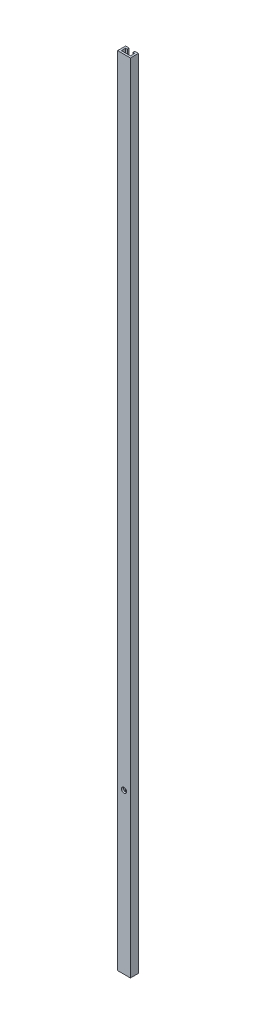
ISO-10303-21;
HEADER;
FILE_DESCRIPTION(('STEP AP214'),'2;1');
FILE_NAME('part.step','',(''),(''),'','','');
FILE_SCHEMA(('AUTOMOTIVE_DESIGN { 1 0 10303 214 1 1 1 1 }'));
ENDSEC;
DATA;
#1=APPLICATION_CONTEXT('core data for automotive mechanical design processes');
#2=APPLICATION_PROTOCOL_DEFINITION('international standard','automotive_design',2000,#1);
#3=PRODUCT_CONTEXT('',#1,'mechanical');
#4=PRODUCT('Part','Part','',(#3));
#5=PRODUCT_RELATED_PRODUCT_CATEGORY('part','',(#4));
#6=PRODUCT_DEFINITION_FORMATION('','',#4);
#7=PRODUCT_DEFINITION_CONTEXT('part definition',#1,'design');
#8=PRODUCT_DEFINITION('design','',#6,#7);
#9=PRODUCT_DEFINITION_SHAPE('','',#8);
#10=(LENGTH_UNIT() NAMED_UNIT(*) SI_UNIT(.MILLI.,.METRE.));
#11=(NAMED_UNIT(*) PLANE_ANGLE_UNIT() SI_UNIT($,.RADIAN.));
#12=(NAMED_UNIT(*) SI_UNIT($,.STERADIAN.) SOLID_ANGLE_UNIT());
#13=UNCERTAINTY_MEASURE_WITH_UNIT(LENGTH_MEASURE(1.E-05),#10,'distance_accuracy_value','');
#14=(GEOMETRIC_REPRESENTATION_CONTEXT(3) GLOBAL_UNCERTAINTY_ASSIGNED_CONTEXT((#13)) GLOBAL_UNIT_ASSIGNED_CONTEXT((#10,
#11,#12)) REPRESENTATION_CONTEXT('',''));
#15=CARTESIAN_POINT('',(0.,0.,0.));
#16=DIRECTION('',(0.,0.,1.));
#17=DIRECTION('',(1.,0.,0.));
#18=AXIS2_PLACEMENT_3D('',#15,#16,#17);
#19=CARTESIAN_POINT('',(0.,500.,0.));
#20=DIRECTION('',(1.,0.,0.));
#21=DIRECTION('',(0.,0.,-1.));
#22=AXIS2_PLACEMENT_3D('',#19,#20,#21);
#23=PLANE('',#22);
#24=DIRECTION('',(0.,0.,1.));
#25=VECTOR('',#24,1.);
#26=CARTESIAN_POINT('',(0.,0.,0.));
#27=LINE('',#26,#25);
#28=CARTESIAN_POINT('',(0.,0.,0.));
#29=VERTEX_POINT('',#28);
#30=CARTESIAN_POINT('',(0.,0.,5.));
#31=VERTEX_POINT('',#30);
#32=EDGE_CURVE('E163',#29,#31,#27,.T.);
#33=ORIENTED_EDGE('',*,*,#32,.T.);
#34=DIRECTION('',(0.,-1.,0.));
#35=VECTOR('',#34,1.);
#36=CARTESIAN_POINT('',(0.,500.,5.));
#37=LINE('',#36,#35);
#38=CARTESIAN_POINT('',(0.,500.,5.));
#39=VERTEX_POINT('',#38);
#40=EDGE_CURVE('E11',#39,#31,#37,.T.);
#41=ORIENTED_EDGE('',*,*,#40,.F.);
#42=DIRECTION('',(0.,0.,1.));
#43=VECTOR('',#42,1.);
#44=CARTESIAN_POINT('',(0.,500.,0.));
#45=LINE('',#44,#43);
#46=CARTESIAN_POINT('',(0.,500.,0.));
#47=VERTEX_POINT('',#46);
#48=EDGE_CURVE('E198',#47,#39,#45,.T.);
#49=ORIENTED_EDGE('',*,*,#48,.F.);
#50=DIRECTION('',(0.,-1.,0.));
#51=VECTOR('',#50,1.);
#52=CARTESIAN_POINT('',(0.,500.,0.));
#53=LINE('',#52,#51);
#54=EDGE_CURVE('E159',#47,#29,#53,.T.);
#55=ORIENTED_EDGE('',*,*,#54,.T.);
#56=EDGE_LOOP('',(#33,#41,#49,#55));
#57=FACE_BOUND('',#56,.T.);
#58=ADVANCED_FACE('F38',(#57),#23,.F.);
#59=CARTESIAN_POINT('',(0.,500.,5.));
#60=DIRECTION('',(0.,0.,-1.));
#61=DIRECTION('',(-1.,0.,0.));
#62=AXIS2_PLACEMENT_3D('',#59,#60,#61);
#63=PLANE('',#62);
#64=CARTESIAN_POINT('',(3.99999999999999,100.,5.));
#65=DIRECTION('',(0.,0.,1.));
#66=DIRECTION('',(1.,0.,0.));
#67=AXIS2_PLACEMENT_3D('',#64,#65,#66);
#68=CIRCLE('',#67,1.6);
#69=CARTESIAN_POINT('',(5.59999999999999,100.,5.));
#70=VERTEX_POINT('',#69);
#71=EDGE_CURVE('E378',#70,#70,#68,.T.);
#72=ORIENTED_EDGE('',*,*,#71,.F.);
#73=EDGE_LOOP('',(#72));
#74=FACE_BOUND('',#73,.T.);
#75=DIRECTION('',(1.,0.,0.));
#76=VECTOR('',#75,1.);
#77=CARTESIAN_POINT('',(0.,0.,5.));
#78=LINE('',#77,#76);
#79=CARTESIAN_POINT('',(8.,0.,5.));
#80=VERTEX_POINT('',#79);
#81=EDGE_CURVE('E167',#31,#80,#78,.T.);
#82=ORIENTED_EDGE('',*,*,#81,.T.);
#83=DIRECTION('',(0.,-1.,0.));
#84=VECTOR('',#83,1.);
#85=CARTESIAN_POINT('',(8.,500.,5.));
#86=LINE('',#85,#84);
#87=CARTESIAN_POINT('',(8.,500.,5.));
#88=VERTEX_POINT('',#87);
#89=EDGE_CURVE('E47',#88,#80,#86,.T.);
#90=ORIENTED_EDGE('',*,*,#89,.F.);
#91=DIRECTION('',(1.,0.,0.));
#92=VECTOR('',#91,1.);
#93=CARTESIAN_POINT('',(0.,500.,5.));
#94=LINE('',#93,#92);
#95=EDGE_CURVE('E110',#39,#88,#94,.T.);
#96=ORIENTED_EDGE('',*,*,#95,.F.);
#97=ORIENTED_EDGE('',*,*,#40,.T.);
#98=EDGE_LOOP('',(#82,#90,#96,#97));
#99=FACE_BOUND('',#98,.T.);
#100=ADVANCED_FACE('F292',(#74,#99),#63,.F.);
#101=CARTESIAN_POINT('',(8.,500.,5.));
#102=DIRECTION('',(-1.,0.,0.));
#103=DIRECTION('',(0.,0.,1.));
#104=AXIS2_PLACEMENT_3D('',#101,#102,#103);
#105=PLANE('',#104);
#106=DIRECTION('',(0.,0.,-1.));
#107=VECTOR('',#106,1.);
#108=CARTESIAN_POINT('',(8.,0.,5.));
#109=LINE('',#108,#107);
#110=CARTESIAN_POINT('',(8.,0.,0.));
#111=VERTEX_POINT('',#110);
#112=EDGE_CURVE('E171',#80,#111,#109,.T.);
#113=ORIENTED_EDGE('',*,*,#112,.T.);
#114=DIRECTION('',(0.,-1.,0.));
#115=VECTOR('',#114,1.);
#116=CARTESIAN_POINT('',(8.,500.,0.));
#117=LINE('',#116,#115);
#118=CARTESIAN_POINT('',(8.,500.,0.));
#119=VERTEX_POINT('',#118);
#120=EDGE_CURVE('E225',#119,#111,#117,.T.);
#121=ORIENTED_EDGE('',*,*,#120,.F.);
#122=DIRECTION('',(0.,0.,-1.));
#123=VECTOR('',#122,1.);
#124=CARTESIAN_POINT('',(8.,500.,5.));
#125=LINE('',#124,#123);
#126=EDGE_CURVE('E235',#88,#119,#125,.T.);
#127=ORIENTED_EDGE('',*,*,#126,.F.);
#128=ORIENTED_EDGE('',*,*,#89,.T.);
#129=EDGE_LOOP('',(#113,#121,#127,#128));
#130=FACE_BOUND('',#129,.T.);
#131=ADVANCED_FACE('F233',(#130),#105,.F.);
#132=CARTESIAN_POINT('',(8.,500.,0.));
#133=DIRECTION('',(0.,0.,1.));
#134=DIRECTION('',(1.,0.,0.));
#135=AXIS2_PLACEMENT_3D('',#132,#133,#134);
#136=PLANE('',#135);
#137=DIRECTION('',(-1.,0.,0.));
#138=VECTOR('',#137,1.);
#139=CARTESIAN_POINT('',(8.,0.,0.));
#140=LINE('',#139,#138);
#141=CARTESIAN_POINT('',(5.75,0.,0.));
#142=VERTEX_POINT('',#141);
#143=EDGE_CURVE('E174',#111,#142,#140,.T.);
#144=ORIENTED_EDGE('',*,*,#143,.T.);
#145=DIRECTION('',(0.,-1.,0.));
#146=VECTOR('',#145,1.);
#147=CARTESIAN_POINT('',(5.75,500.,0.));
#148=LINE('',#147,#146);
#149=CARTESIAN_POINT('',(5.75,500.,0.));
#150=VERTEX_POINT('',#149);
#151=EDGE_CURVE('E221',#150,#142,#148,.T.);
#152=ORIENTED_EDGE('',*,*,#151,.F.);
#153=DIRECTION('',(-1.,0.,0.));
#154=VECTOR('',#153,1.);
#155=CARTESIAN_POINT('',(8.,500.,0.));
#156=LINE('',#155,#154);
#157=EDGE_CURVE('E254',#119,#150,#156,.T.);
#158=ORIENTED_EDGE('',*,*,#157,.F.);
#159=ORIENTED_EDGE('',*,*,#120,.T.);
#160=EDGE_LOOP('',(#144,#152,#158,#159));
#161=FACE_BOUND('',#160,.T.);
#162=ADVANCED_FACE('F244',(#161),#136,.F.);
#163=CARTESIAN_POINT('',(5.75,500.,0.));
#164=DIRECTION('',(1.,0.,0.));
#165=DIRECTION('',(0.,0.,-1.));
#166=AXIS2_PLACEMENT_3D('',#163,#164,#165);
#167=PLANE('',#166);
#168=DIRECTION('',(0.,0.,1.));
#169=VECTOR('',#168,1.);
#170=CARTESIAN_POINT('',(5.75,0.,0.));
#171=LINE('',#170,#169);
#172=CARTESIAN_POINT('',(5.75,0.,1.15));
#173=VERTEX_POINT('',#172);
#174=EDGE_CURVE('E177',#142,#173,#171,.T.);
#175=ORIENTED_EDGE('',*,*,#174,.T.);
#176=DIRECTION('',(0.,-1.,0.));
#177=VECTOR('',#176,1.);
#178=CARTESIAN_POINT('',(5.75,500.,1.15));
#179=LINE('',#178,#177);
#180=CARTESIAN_POINT('',(5.75,500.,1.15));
#181=VERTEX_POINT('',#180);
#182=EDGE_CURVE('E217',#181,#173,#179,.T.);
#183=ORIENTED_EDGE('',*,*,#182,.F.);
#184=DIRECTION('',(0.,0.,1.));
#185=VECTOR('',#184,1.);
#186=CARTESIAN_POINT('',(5.75,500.,0.));
#187=LINE('',#186,#185);
#188=EDGE_CURVE('E250',#150,#181,#187,.T.);
#189=ORIENTED_EDGE('',*,*,#188,.F.);
#190=ORIENTED_EDGE('',*,*,#151,.T.);
#191=EDGE_LOOP('',(#175,#183,#189,#190));
#192=FACE_BOUND('',#191,.T.);
#193=ADVANCED_FACE('F248',(#192),#167,.F.);
#194=CARTESIAN_POINT('',(5.75,500.,1.15));
#195=DIRECTION('',(0.,0.,-1.));
#196=DIRECTION('',(-1.,0.,0.));
#197=AXIS2_PLACEMENT_3D('',#194,#195,#196);
#198=PLANE('',#197);
#199=DIRECTION('',(1.,0.,0.));
#200=VECTOR('',#199,1.);
#201=CARTESIAN_POINT('',(5.75,0.,1.15));
#202=LINE('',#201,#200);
#203=CARTESIAN_POINT('',(6.85,0.,1.15));
#204=VERTEX_POINT('',#203);
#205=EDGE_CURVE('E180',#173,#204,#202,.T.);
#206=ORIENTED_EDGE('',*,*,#205,.T.);
#207=DIRECTION('',(0.,-1.,0.));
#208=VECTOR('',#207,1.);
#209=CARTESIAN_POINT('',(6.85,500.,1.15));
#210=LINE('',#209,#208);
#211=CARTESIAN_POINT('',(6.85,500.,1.15));
#212=VERTEX_POINT('',#211);
#213=EDGE_CURVE('E213',#212,#204,#210,.T.);
#214=ORIENTED_EDGE('',*,*,#213,.F.);
#215=DIRECTION('',(1.,0.,0.));
#216=VECTOR('',#215,1.);
#217=CARTESIAN_POINT('',(5.75,500.,1.15));
#218=LINE('',#217,#216);
#219=EDGE_CURVE('E253',#181,#212,#218,.T.);
#220=ORIENTED_EDGE('',*,*,#219,.F.);
#221=ORIENTED_EDGE('',*,*,#182,.T.);
#222=EDGE_LOOP('',(#206,#214,#220,#221));
#223=FACE_BOUND('',#222,.T.);
#224=ADVANCED_FACE('F307',(#223),#198,.F.);
#225=CARTESIAN_POINT('',(6.85,500.,1.15));
#226=DIRECTION('',(1.,0.,0.));
#227=DIRECTION('',(0.,0.,-1.));
#228=AXIS2_PLACEMENT_3D('',#225,#226,#227);
#229=PLANE('',#228);
#230=DIRECTION('',(0.,0.,1.));
#231=VECTOR('',#230,1.);
#232=CARTESIAN_POINT('',(6.85,0.,1.15));
#233=LINE('',#232,#231);
#234=CARTESIAN_POINT('',(6.85,0.,3.85));
#235=VERTEX_POINT('',#234);
#236=EDGE_CURVE('E183',#204,#235,#233,.T.);
#237=ORIENTED_EDGE('',*,*,#236,.T.);
#238=DIRECTION('',(0.,-1.,0.));
#239=VECTOR('',#238,1.);
#240=CARTESIAN_POINT('',(6.85,500.,3.85));
#241=LINE('',#240,#239);
#242=CARTESIAN_POINT('',(6.85,500.,3.85));
#243=VERTEX_POINT('',#242);
#244=EDGE_CURVE('E209',#243,#235,#241,.T.);
#245=ORIENTED_EDGE('',*,*,#244,.F.);
#246=DIRECTION('',(0.,0.,1.));
#247=VECTOR('',#246,1.);
#248=CARTESIAN_POINT('',(6.85,500.,1.15));
#249=LINE('',#248,#247);
#250=EDGE_CURVE('E258',#212,#243,#249,.T.);
#251=ORIENTED_EDGE('',*,*,#250,.F.);
#252=ORIENTED_EDGE('',*,*,#213,.T.);
#253=EDGE_LOOP('',(#237,#245,#251,#252));
#254=FACE_BOUND('',#253,.T.);
#255=ADVANCED_FACE('F310',(#254),#229,.F.);
#256=CARTESIAN_POINT('',(6.85,500.,3.85));
#257=DIRECTION('',(0.,0.,1.));
#258=DIRECTION('',(1.,0.,0.));
#259=AXIS2_PLACEMENT_3D('',#256,#257,#258);
#260=PLANE('',#259);
#261=CARTESIAN_POINT('',(3.99999999999999,100.,3.85));
#262=DIRECTION('',(0.,0.,1.));
#263=DIRECTION('',(1.,0.,0.));
#264=AXIS2_PLACEMENT_3D('',#261,#262,#263);
#265=CIRCLE('',#264,1.6);
#266=CARTESIAN_POINT('',(5.59999999999999,100.,3.85));
#267=VERTEX_POINT('',#266);
#268=EDGE_CURVE('E168',#267,#267,#265,.F.);
#269=ORIENTED_EDGE('',*,*,#268,.F.);
#270=EDGE_LOOP('',(#269));
#271=FACE_BOUND('',#270,.T.);
#272=DIRECTION('',(-1.,0.,0.));
#273=VECTOR('',#272,1.);
#274=CARTESIAN_POINT('',(6.85,0.,3.85));
#275=LINE('',#274,#273);
#276=CARTESIAN_POINT('',(1.15,0.,3.85));
#277=VERTEX_POINT('',#276);
#278=EDGE_CURVE('E186',#235,#277,#275,.T.);
#279=ORIENTED_EDGE('',*,*,#278,.T.);
#280=DIRECTION('',(0.,-1.,0.));
#281=VECTOR('',#280,1.);
#282=CARTESIAN_POINT('',(1.15,500.,3.85));
#283=LINE('',#282,#281);
#284=CARTESIAN_POINT('',(1.15,500.,3.85));
#285=VERTEX_POINT('',#284);
#286=EDGE_CURVE('E205',#285,#277,#283,.T.);
#287=ORIENTED_EDGE('',*,*,#286,.F.);
#288=DIRECTION('',(-1.,0.,0.));
#289=VECTOR('',#288,1.);
#290=CARTESIAN_POINT('',(6.85,500.,3.85));
#291=LINE('',#290,#289);
#292=EDGE_CURVE('E265',#243,#285,#291,.T.);
#293=ORIENTED_EDGE('',*,*,#292,.F.);
#294=ORIENTED_EDGE('',*,*,#244,.T.);
#295=EDGE_LOOP('',(#279,#287,#293,#294));
#296=FACE_BOUND('',#295,.T.);
#297=ADVANCED_FACE('F273',(#271,#296),#260,.F.);
#298=CARTESIAN_POINT('',(1.15,500.,3.85));
#299=DIRECTION('',(-1.,0.,0.));
#300=DIRECTION('',(0.,0.,1.));
#301=AXIS2_PLACEMENT_3D('',#298,#299,#300);
#302=PLANE('',#301);
#303=DIRECTION('',(0.,0.,-1.));
#304=VECTOR('',#303,1.);
#305=CARTESIAN_POINT('',(1.15,0.,3.85));
#306=LINE('',#305,#304);
#307=CARTESIAN_POINT('',(1.15,0.,1.15));
#308=VERTEX_POINT('',#307);
#309=EDGE_CURVE('E189',#277,#308,#306,.T.);
#310=ORIENTED_EDGE('',*,*,#309,.T.);
#311=DIRECTION('',(0.,-1.,0.));
#312=VECTOR('',#311,1.);
#313=CARTESIAN_POINT('',(1.15,500.,1.15));
#314=LINE('',#313,#312);
#315=CARTESIAN_POINT('',(1.15,500.,1.15));
#316=VERTEX_POINT('',#315);
#317=EDGE_CURVE('E152',#316,#308,#314,.T.);
#318=ORIENTED_EDGE('',*,*,#317,.F.);
#319=DIRECTION('',(0.,0.,-1.));
#320=VECTOR('',#319,1.);
#321=CARTESIAN_POINT('',(1.15,500.,3.85));
#322=LINE('',#321,#320);
#323=EDGE_CURVE('E141',#285,#316,#322,.T.);
#324=ORIENTED_EDGE('',*,*,#323,.F.);
#325=ORIENTED_EDGE('',*,*,#286,.T.);
#326=EDGE_LOOP('',(#310,#318,#324,#325));
#327=FACE_BOUND('',#326,.T.);
#328=ADVANCED_FACE('F277',(#327),#302,.F.);
#329=CARTESIAN_POINT('',(1.15,500.,1.15));
#330=DIRECTION('',(0.,0.,-1.));
#331=DIRECTION('',(-1.,0.,0.));
#332=AXIS2_PLACEMENT_3D('',#329,#330,#331);
#333=PLANE('',#332);
#334=DIRECTION('',(1.,0.,0.));
#335=VECTOR('',#334,1.);
#336=CARTESIAN_POINT('',(1.15,0.,1.15));
#337=LINE('',#336,#335);
#338=CARTESIAN_POINT('',(2.25,0.,1.15));
#339=VERTEX_POINT('',#338);
#340=EDGE_CURVE('E150',#308,#339,#337,.T.);
#341=ORIENTED_EDGE('',*,*,#340,.T.);
#342=DIRECTION('',(0.,-1.,0.));
#343=VECTOR('',#342,1.);
#344=CARTESIAN_POINT('',(2.25,500.,1.15));
#345=LINE('',#344,#343);
#346=CARTESIAN_POINT('',(2.25,500.,1.15));
#347=VERTEX_POINT('',#346);
#348=EDGE_CURVE('E147',#347,#339,#345,.T.);
#349=ORIENTED_EDGE('',*,*,#348,.F.);
#350=DIRECTION('',(1.,0.,0.));
#351=VECTOR('',#350,1.);
#352=CARTESIAN_POINT('',(1.15,500.,1.15));
#353=LINE('',#352,#351);
#354=EDGE_CURVE('E135',#316,#347,#353,.T.);
#355=ORIENTED_EDGE('',*,*,#354,.F.);
#356=ORIENTED_EDGE('',*,*,#317,.T.);
#357=EDGE_LOOP('',(#341,#349,#355,#356));
#358=FACE_BOUND('',#357,.T.);
#359=ADVANCED_FACE('F148',(#358),#333,.F.);
#360=CARTESIAN_POINT('',(2.25,500.,1.15));
#361=DIRECTION('',(-1.,0.,0.));
#362=DIRECTION('',(0.,0.,1.));
#363=AXIS2_PLACEMENT_3D('',#360,#361,#362);
#364=PLANE('',#363);
#365=DIRECTION('',(0.,0.,-1.));
#366=VECTOR('',#365,1.);
#367=CARTESIAN_POINT('',(2.25,0.,1.15));
#368=LINE('',#367,#366);
#369=CARTESIAN_POINT('',(2.25,0.,0.));
#370=VERTEX_POINT('',#369);
#371=EDGE_CURVE('E96',#339,#370,#368,.T.);
#372=ORIENTED_EDGE('',*,*,#371,.T.);
#373=DIRECTION('',(0.,-1.,0.));
#374=VECTOR('',#373,1.);
#375=CARTESIAN_POINT('',(2.25,500.,0.));
#376=LINE('',#375,#374);
#377=CARTESIAN_POINT('',(2.25,500.,0.));
#378=VERTEX_POINT('',#377);
#379=EDGE_CURVE('E153',#378,#370,#376,.T.);
#380=ORIENTED_EDGE('',*,*,#379,.F.);
#381=DIRECTION('',(0.,0.,-1.));
#382=VECTOR('',#381,1.);
#383=CARTESIAN_POINT('',(2.25,500.,1.15));
#384=LINE('',#383,#382);
#385=EDGE_CURVE('E139',#347,#378,#384,.T.);
#386=ORIENTED_EDGE('',*,*,#385,.F.);
#387=ORIENTED_EDGE('',*,*,#348,.T.);
#388=EDGE_LOOP('',(#372,#380,#386,#387));
#389=FACE_BOUND('',#388,.T.);
#390=ADVANCED_FACE('F155',(#389),#364,.F.);
#391=CARTESIAN_POINT('',(2.25,500.,0.));
#392=DIRECTION('',(0.,0.,1.));
#393=DIRECTION('',(1.,0.,0.));
#394=AXIS2_PLACEMENT_3D('',#391,#392,#393);
#395=PLANE('',#394);
#396=DIRECTION('',(-1.,0.,0.));
#397=VECTOR('',#396,1.);
#398=CARTESIAN_POINT('',(2.25,0.,0.));
#399=LINE('',#398,#397);
#400=EDGE_CURVE('E102',#370,#29,#399,.T.);
#401=ORIENTED_EDGE('',*,*,#400,.T.);
#402=ORIENTED_EDGE('',*,*,#54,.F.);
#403=DIRECTION('',(-1.,0.,0.));
#404=VECTOR('',#403,1.);
#405=CARTESIAN_POINT('',(2.25,500.,0.));
#406=LINE('',#405,#404);
#407=EDGE_CURVE('E55',#378,#47,#406,.T.);
#408=ORIENTED_EDGE('',*,*,#407,.F.);
#409=ORIENTED_EDGE('',*,*,#379,.T.);
#410=EDGE_LOOP('',(#401,#402,#408,#409));
#411=FACE_BOUND('',#410,.T.);
#412=ADVANCED_FACE('F281',(#411),#395,.F.);
#413=CARTESIAN_POINT('',(0.,500.,0.));
#414=DIRECTION('',(0.,1.,0.));
#415=DIRECTION('',(0.,0.,1.));
#416=AXIS2_PLACEMENT_3D('',#413,#414,#415);
#417=PLANE('',#416);
#418=ORIENTED_EDGE('',*,*,#48,.T.);
#419=ORIENTED_EDGE('',*,*,#95,.T.);
#420=ORIENTED_EDGE('',*,*,#126,.T.);
#421=ORIENTED_EDGE('',*,*,#157,.T.);
#422=ORIENTED_EDGE('',*,*,#188,.T.);
#423=ORIENTED_EDGE('',*,*,#219,.T.);
#424=ORIENTED_EDGE('',*,*,#250,.T.);
#425=ORIENTED_EDGE('',*,*,#292,.T.);
#426=ORIENTED_EDGE('',*,*,#323,.T.);
#427=ORIENTED_EDGE('',*,*,#354,.T.);
#428=ORIENTED_EDGE('',*,*,#385,.T.);
#429=ORIENTED_EDGE('',*,*,#407,.T.);
#430=EDGE_LOOP('',(#418,#419,#420,#421,#422,#423,#424,#425,#426,#427,#428,#429));
#431=FACE_BOUND('',#430,.T.);
#432=ADVANCED_FACE('F137',(#431),#417,.T.);
#433=CARTESIAN_POINT('',(0.,0.,0.));
#434=DIRECTION('',(0.,1.,0.));
#435=DIRECTION('',(0.,0.,1.));
#436=AXIS2_PLACEMENT_3D('',#433,#434,#435);
#437=PLANE('',#436);
#438=ORIENTED_EDGE('',*,*,#32,.F.);
#439=ORIENTED_EDGE('',*,*,#400,.F.);
#440=ORIENTED_EDGE('',*,*,#371,.F.);
#441=ORIENTED_EDGE('',*,*,#340,.F.);
#442=ORIENTED_EDGE('',*,*,#309,.F.);
#443=ORIENTED_EDGE('',*,*,#278,.F.);
#444=ORIENTED_EDGE('',*,*,#236,.F.);
#445=ORIENTED_EDGE('',*,*,#205,.F.);
#446=ORIENTED_EDGE('',*,*,#174,.F.);
#447=ORIENTED_EDGE('',*,*,#143,.F.);
#448=ORIENTED_EDGE('',*,*,#112,.F.);
#449=ORIENTED_EDGE('',*,*,#81,.F.);
#450=EDGE_LOOP('',(#438,#439,#440,#441,#442,#443,#444,#445,#446,#447,#448,#449));
#451=FACE_BOUND('',#450,.T.);
#452=ADVANCED_FACE('F239',(#451),#437,.F.);
#453=CARTESIAN_POINT('',(3.99999999999999,100.,-0.675483399593912));
#454=DIRECTION('',(0.,0.,1.));
#455=DIRECTION('',(1.,0.,0.));
#456=AXIS2_PLACEMENT_3D('',#453,#454,#455);
#457=CYLINDRICAL_SURFACE('',#456,1.6);
#458=ORIENTED_EDGE('',*,*,#268,.T.);
#459=EDGE_LOOP('',(#458));
#460=FACE_BOUND('',#459,.T.);
#461=ORIENTED_EDGE('',*,*,#71,.T.);
#462=EDGE_LOOP('',(#461));
#463=FACE_BOUND('',#462,.T.);
#464=ADVANCED_FACE('F347',(#460,#463),#457,.F.);
#465=CLOSED_SHELL('',(#58,#100,#131,#162,#193,#224,#255,#297,#328,#359,#390,#412,#432,#452,#464));
#466=MANIFOLD_SOLID_BREP('B2',#465);
#467=ADVANCED_BREP_SHAPE_REPRESENTATION('',(#18,#466),#14);
#468=SHAPE_DEFINITION_REPRESENTATION(#9,#467);
ENDSEC;
END-ISO-10303-21;
